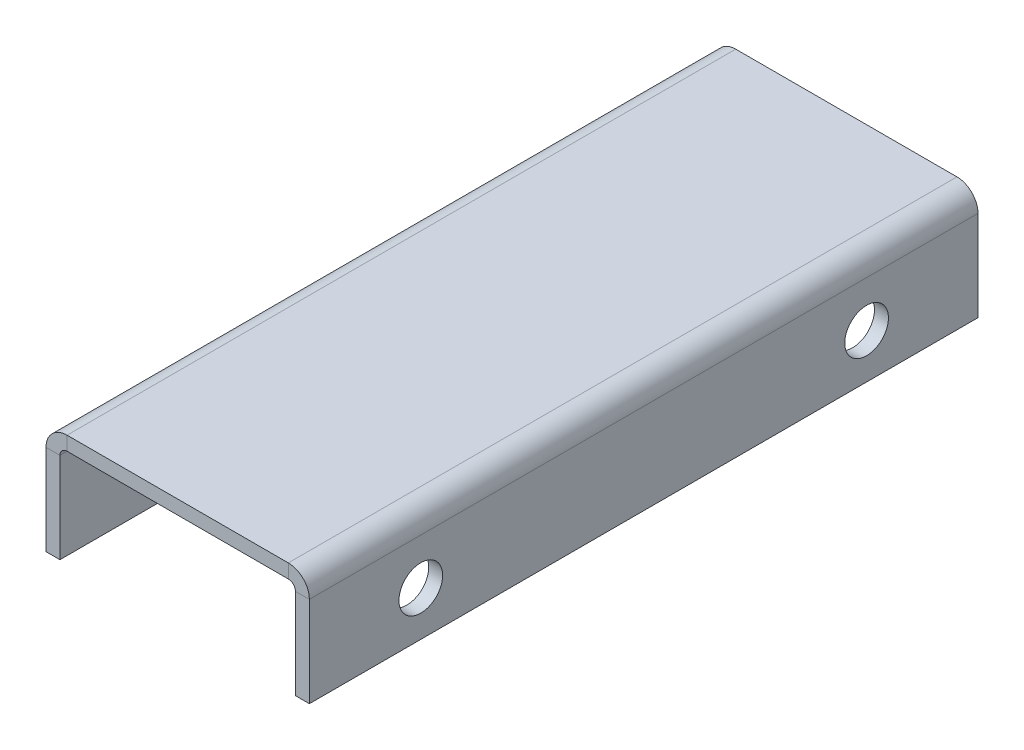
ISO-10303-21;
HEADER;
FILE_DESCRIPTION(('STEP AP214'),'2;1');
FILE_NAME('part.step','',(''),(''),'','','');
FILE_SCHEMA(('AUTOMOTIVE_DESIGN { 1 0 10303 214 1 1 1 1 }'));
ENDSEC;
DATA;
#1=APPLICATION_CONTEXT('core data for automotive mechanical design processes');
#2=APPLICATION_PROTOCOL_DEFINITION('international standard','automotive_design',2000,#1);
#3=PRODUCT_CONTEXT('',#1,'mechanical');
#4=PRODUCT('Part','Part','',(#3));
#5=PRODUCT_RELATED_PRODUCT_CATEGORY('part','',(#4));
#6=PRODUCT_DEFINITION_FORMATION('','',#4);
#7=PRODUCT_DEFINITION_CONTEXT('part definition',#1,'design');
#8=PRODUCT_DEFINITION('design','',#6,#7);
#9=PRODUCT_DEFINITION_SHAPE('','',#8);
#10=(LENGTH_UNIT() NAMED_UNIT(*) SI_UNIT(.MILLI.,.METRE.));
#11=(NAMED_UNIT(*) PLANE_ANGLE_UNIT() SI_UNIT($,.RADIAN.));
#12=(NAMED_UNIT(*) SI_UNIT($,.STERADIAN.) SOLID_ANGLE_UNIT());
#13=UNCERTAINTY_MEASURE_WITH_UNIT(LENGTH_MEASURE(1.E-05),#10,'distance_accuracy_value','');
#14=(GEOMETRIC_REPRESENTATION_CONTEXT(3) GLOBAL_UNCERTAINTY_ASSIGNED_CONTEXT((#13)) GLOBAL_UNIT_ASSIGNED_CONTEXT((#10,
#11,#12)) REPRESENTATION_CONTEXT('',''));
#15=CARTESIAN_POINT('',(0.,0.,0.));
#16=DIRECTION('',(0.,0.,1.));
#17=DIRECTION('',(1.,0.,0.));
#18=AXIS2_PLACEMENT_3D('',#15,#16,#17);
#19=CARTESIAN_POINT('',(-12.60602,0.,76.2));
#20=DIRECTION('',(0.,0.,1.));
#21=DIRECTION('',(1.,0.,0.));
#22=AXIS2_PLACEMENT_3D('',#19,#20,#21);
#23=PLANE('',#22);
#24=DIRECTION('',(0.,-1.,0.));
#25=VECTOR('',#24,1.);
#26=CARTESIAN_POINT('',(-12.60602,0.,76.2));
#27=LINE('',#26,#25);
#28=CARTESIAN_POINT('',(-12.60602,0.,76.2));
#29=VERTEX_POINT('',#28);
#30=CARTESIAN_POINT('',(-12.60602,-1.5875,76.2));
#31=VERTEX_POINT('',#30);
#32=EDGE_CURVE('E11',#29,#31,#27,.T.);
#33=ORIENTED_EDGE('',*,*,#32,.F.);
#34=CARTESIAN_POINT('',(-12.60602,-2.4003,76.2));
#35=DIRECTION('',(0.,0.,1.));
#36=DIRECTION('',(1.,0.,0.));
#37=AXIS2_PLACEMENT_3D('',#34,#35,#36);
#38=CIRCLE('',#37,2.4003);
#39=CARTESIAN_POINT('',(-15.00632,-2.4003,76.2));
#40=VERTEX_POINT('',#39);
#41=EDGE_CURVE('E280',#40,#29,#38,.F.);
#42=ORIENTED_EDGE('',*,*,#41,.F.);
#43=DIRECTION('',(-1.,0.,0.));
#44=VECTOR('',#43,1.);
#45=CARTESIAN_POINT('',(-13.41882,-2.4003,76.2));
#46=LINE('',#45,#44);
#47=CARTESIAN_POINT('',(-13.41882,-2.4003,76.2));
#48=VERTEX_POINT('',#47);
#49=EDGE_CURVE('E53',#48,#40,#46,.T.);
#50=ORIENTED_EDGE('',*,*,#49,.F.);
#51=CARTESIAN_POINT('',(-12.60602,-2.4003,76.2));
#52=DIRECTION('',(0.,0.,1.));
#53=DIRECTION('',(1.,0.,0.));
#54=AXIS2_PLACEMENT_3D('',#51,#52,#53);
#55=CIRCLE('',#54,0.8128);
#56=EDGE_CURVE('E155',#48,#31,#55,.F.);
#57=ORIENTED_EDGE('',*,*,#56,.T.);
#58=EDGE_LOOP('',(#33,#42,#50,#57));
#59=FACE_BOUND('',#58,.T.);
#60=ADVANCED_FACE('F44',(#59),#23,.T.);
#61=CARTESIAN_POINT('',(-13.41882,-2.4003,76.2));
#62=DIRECTION('',(0.,0.,1.));
#63=DIRECTION('',(1.,0.,0.));
#64=AXIS2_PLACEMENT_3D('',#61,#62,#63);
#65=PLANE('',#64);
#66=DIRECTION('',(1.,0.,0.));
#67=VECTOR('',#66,1.);
#68=CARTESIAN_POINT('',(-15.00632,0.,76.2));
#69=LINE('',#68,#67);
#70=CARTESIAN_POINT('',(12.60602,0.,76.2));
#71=VERTEX_POINT('',#70);
#72=EDGE_CURVE('E149',#29,#71,#69,.T.);
#73=ORIENTED_EDGE('',*,*,#72,.F.);
#74=ORIENTED_EDGE('',*,*,#32,.T.);
#75=DIRECTION('',(1.,0.,0.));
#76=VECTOR('',#75,1.);
#77=CARTESIAN_POINT('',(-15.00632,-1.5875,76.2));
#78=LINE('',#77,#76);
#79=CARTESIAN_POINT('',(12.60602,-1.5875,76.2));
#80=VERTEX_POINT('',#79);
#81=EDGE_CURVE('E146',#31,#80,#78,.T.);
#82=ORIENTED_EDGE('',*,*,#81,.T.);
#83=DIRECTION('',(0.,1.,0.));
#84=VECTOR('',#83,1.);
#85=CARTESIAN_POINT('',(12.60602,-1.5875,76.2));
#86=LINE('',#85,#84);
#87=EDGE_CURVE('E238',#80,#71,#86,.T.);
#88=ORIENTED_EDGE('',*,*,#87,.T.);
#89=EDGE_LOOP('',(#73,#74,#82,#88));
#90=FACE_BOUND('',#89,.T.);
#91=ADVANCED_FACE('F144',(#90),#65,.T.);
#92=CARTESIAN_POINT('',(-15.00632,-2.4003,0.));
#93=DIRECTION('',(0.,0.,-1.));
#94=DIRECTION('',(-1.,0.,0.));
#95=AXIS2_PLACEMENT_3D('',#92,#93,#94);
#96=PLANE('',#95);
#97=DIRECTION('',(1.,0.,0.));
#98=VECTOR('',#97,1.);
#99=CARTESIAN_POINT('',(-15.00632,-2.4003,0.));
#100=LINE('',#99,#98);
#101=CARTESIAN_POINT('',(-15.00632,-2.4003,0.));
#102=VERTEX_POINT('',#101);
#103=CARTESIAN_POINT('',(-13.41882,-2.4003,0.));
#104=VERTEX_POINT('',#103);
#105=EDGE_CURVE('E243',#102,#104,#100,.T.);
#106=ORIENTED_EDGE('',*,*,#105,.F.);
#107=CARTESIAN_POINT('',(-12.60602,-2.4003,0.));
#108=DIRECTION('',(0.,0.,1.));
#109=DIRECTION('',(1.,0.,0.));
#110=AXIS2_PLACEMENT_3D('',#107,#108,#109);
#111=CIRCLE('',#110,2.4003);
#112=CARTESIAN_POINT('',(-12.60602,0.,0.));
#113=VERTEX_POINT('',#112);
#114=EDGE_CURVE('E195',#102,#113,#111,.F.);
#115=ORIENTED_EDGE('',*,*,#114,.T.);
#116=DIRECTION('',(0.,1.,0.));
#117=VECTOR('',#116,1.);
#118=CARTESIAN_POINT('',(-12.60602,-1.5875,0.));
#119=LINE('',#118,#117);
#120=CARTESIAN_POINT('',(-12.60602,-1.5875,0.));
#121=VERTEX_POINT('',#120);
#122=EDGE_CURVE('E241',#121,#113,#119,.T.);
#123=ORIENTED_EDGE('',*,*,#122,.F.);
#124=CARTESIAN_POINT('',(-12.60602,-2.4003,0.));
#125=DIRECTION('',(0.,0.,1.));
#126=DIRECTION('',(1.,0.,0.));
#127=AXIS2_PLACEMENT_3D('',#124,#125,#126);
#128=CIRCLE('',#127,0.8128);
#129=EDGE_CURVE('E167',#104,#121,#128,.F.);
#130=ORIENTED_EDGE('',*,*,#129,.F.);
#131=EDGE_LOOP('',(#106,#115,#123,#130));
#132=FACE_BOUND('',#131,.T.);
#133=ADVANCED_FACE('F298',(#132),#96,.T.);
#134=CARTESIAN_POINT('',(-12.60602,-1.5875,0.));
#135=DIRECTION('',(0.,0.,-1.));
#136=DIRECTION('',(-1.,0.,0.));
#137=AXIS2_PLACEMENT_3D('',#134,#135,#136);
#138=PLANE('',#137);
#139=DIRECTION('',(0.,1.,0.));
#140=VECTOR('',#139,1.);
#141=CARTESIAN_POINT('',(-15.00632,-12.7,0.));
#142=LINE('',#141,#140);
#143=CARTESIAN_POINT('',(-15.00632,-12.7,0.));
#144=VERTEX_POINT('',#143);
#145=EDGE_CURVE('E198',#144,#102,#142,.T.);
#146=ORIENTED_EDGE('',*,*,#145,.T.);
#147=ORIENTED_EDGE('',*,*,#105,.T.);
#148=DIRECTION('',(0.,1.,0.));
#149=VECTOR('',#148,1.);
#150=CARTESIAN_POINT('',(-13.41882,-12.7,0.));
#151=LINE('',#150,#149);
#152=CARTESIAN_POINT('',(-13.41882,-12.7,0.));
#153=VERTEX_POINT('',#152);
#154=EDGE_CURVE('E204',#153,#104,#151,.T.);
#155=ORIENTED_EDGE('',*,*,#154,.F.);
#156=DIRECTION('',(-1.,0.,0.));
#157=VECTOR('',#156,1.);
#158=CARTESIAN_POINT('',(-13.41882,-12.7,0.));
#159=LINE('',#158,#157);
#160=EDGE_CURVE('E201',#153,#144,#159,.T.);
#161=ORIENTED_EDGE('',*,*,#160,.T.);
#162=EDGE_LOOP('',(#146,#147,#155,#161));
#163=FACE_BOUND('',#162,.T.);
#164=ADVANCED_FACE('F348',(#163),#138,.T.);
#165=CARTESIAN_POINT('',(15.00632,-2.4003,76.2));
#166=DIRECTION('',(0.,0.,1.));
#167=DIRECTION('',(1.,0.,0.));
#168=AXIS2_PLACEMENT_3D('',#165,#166,#167);
#169=PLANE('',#168);
#170=DIRECTION('',(-1.,0.,0.));
#171=VECTOR('',#170,1.);
#172=CARTESIAN_POINT('',(15.00632,-2.4003,76.2));
#173=LINE('',#172,#171);
#174=CARTESIAN_POINT('',(15.00632,-2.4003,76.2));
#175=VERTEX_POINT('',#174);
#176=CARTESIAN_POINT('',(13.41882,-2.4003,76.2));
#177=VERTEX_POINT('',#176);
#178=EDGE_CURVE('E62',#175,#177,#173,.T.);
#179=ORIENTED_EDGE('',*,*,#178,.F.);
#180=CARTESIAN_POINT('',(12.60602,-2.4003,76.2));
#181=DIRECTION('',(0.,0.,1.));
#182=DIRECTION('',(1.,0.,0.));
#183=AXIS2_PLACEMENT_3D('',#180,#181,#182);
#184=CIRCLE('',#183,2.4003);
#185=EDGE_CURVE('E276',#71,#175,#184,.F.);
#186=ORIENTED_EDGE('',*,*,#185,.F.);
#187=ORIENTED_EDGE('',*,*,#87,.F.);
#188=CARTESIAN_POINT('',(12.60602,-2.4003,76.2));
#189=DIRECTION('',(0.,0.,1.));
#190=DIRECTION('',(1.,0.,0.));
#191=AXIS2_PLACEMENT_3D('',#188,#189,#190);
#192=CIRCLE('',#191,0.8128);
#193=EDGE_CURVE('E175',#80,#177,#192,.F.);
#194=ORIENTED_EDGE('',*,*,#193,.T.);
#195=EDGE_LOOP('',(#179,#186,#187,#194));
#196=FACE_BOUND('',#195,.T.);
#197=ADVANCED_FACE('F353',(#196),#169,.T.);
#198=CARTESIAN_POINT('',(12.60602,-1.5875,76.2));
#199=DIRECTION('',(0.,0.,1.));
#200=DIRECTION('',(1.,0.,0.));
#201=AXIS2_PLACEMENT_3D('',#198,#199,#200);
#202=PLANE('',#201);
#203=DIRECTION('',(0.,-1.,0.));
#204=VECTOR('',#203,1.);
#205=CARTESIAN_POINT('',(15.00632,0.,76.2));
#206=LINE('',#205,#204);
#207=CARTESIAN_POINT('',(15.00632,-12.7,76.2));
#208=VERTEX_POINT('',#207);
#209=EDGE_CURVE('E273',#175,#208,#206,.T.);
#210=ORIENTED_EDGE('',*,*,#209,.F.);
#211=ORIENTED_EDGE('',*,*,#178,.T.);
#212=DIRECTION('',(0.,1.,0.));
#213=VECTOR('',#212,1.);
#214=CARTESIAN_POINT('',(13.41882,0.,76.2));
#215=LINE('',#214,#213);
#216=CARTESIAN_POINT('',(13.41882,-12.7,76.2));
#217=VERTEX_POINT('',#216);
#218=EDGE_CURVE('E116',#177,#217,#215,.F.);
#219=ORIENTED_EDGE('',*,*,#218,.T.);
#220=DIRECTION('',(-1.,0.,0.));
#221=VECTOR('',#220,1.);
#222=CARTESIAN_POINT('',(15.00632,-12.7,76.2));
#223=LINE('',#222,#221);
#224=EDGE_CURVE('E270',#208,#217,#223,.T.);
#225=ORIENTED_EDGE('',*,*,#224,.F.);
#226=EDGE_LOOP('',(#210,#211,#219,#225));
#227=FACE_BOUND('',#226,.T.);
#228=ADVANCED_FACE('F325',(#227),#202,.T.);
#229=CARTESIAN_POINT('',(12.60602,0.,0.));
#230=DIRECTION('',(0.,0.,-1.));
#231=DIRECTION('',(-1.,0.,0.));
#232=AXIS2_PLACEMENT_3D('',#229,#230,#231);
#233=PLANE('',#232);
#234=DIRECTION('',(0.,-1.,0.));
#235=VECTOR('',#234,1.);
#236=CARTESIAN_POINT('',(12.60602,0.,0.));
#237=LINE('',#236,#235);
#238=CARTESIAN_POINT('',(12.60602,0.,0.));
#239=VERTEX_POINT('',#238);
#240=CARTESIAN_POINT('',(12.60602,-1.5875,0.));
#241=VERTEX_POINT('',#240);
#242=EDGE_CURVE('E103',#239,#241,#237,.T.);
#243=ORIENTED_EDGE('',*,*,#242,.F.);
#244=CARTESIAN_POINT('',(12.60602,-2.4003,0.));
#245=DIRECTION('',(0.,0.,1.));
#246=DIRECTION('',(1.,0.,0.));
#247=AXIS2_PLACEMENT_3D('',#244,#245,#246);
#248=CIRCLE('',#247,2.4003);
#249=CARTESIAN_POINT('',(15.00632,-2.4003,0.));
#250=VERTEX_POINT('',#249);
#251=EDGE_CURVE('E191',#239,#250,#248,.F.);
#252=ORIENTED_EDGE('',*,*,#251,.T.);
#253=DIRECTION('',(1.,0.,0.));
#254=VECTOR('',#253,1.);
#255=CARTESIAN_POINT('',(13.41882,-2.4003,0.));
#256=LINE('',#255,#254);
#257=CARTESIAN_POINT('',(13.41882,-2.4003,0.));
#258=VERTEX_POINT('',#257);
#259=EDGE_CURVE('E110',#258,#250,#256,.T.);
#260=ORIENTED_EDGE('',*,*,#259,.F.);
#261=CARTESIAN_POINT('',(12.60602,-2.4003,0.));
#262=DIRECTION('',(0.,0.,1.));
#263=DIRECTION('',(1.,0.,0.));
#264=AXIS2_PLACEMENT_3D('',#261,#262,#263);
#265=CIRCLE('',#264,0.8128);
#266=EDGE_CURVE('E210',#241,#258,#265,.F.);
#267=ORIENTED_EDGE('',*,*,#266,.F.);
#268=EDGE_LOOP('',(#243,#252,#260,#267));
#269=FACE_BOUND('',#268,.T.);
#270=ADVANCED_FACE('F313',(#269),#233,.T.);
#271=CARTESIAN_POINT('',(13.41882,-2.4003,0.));
#272=DIRECTION('',(0.,0.,-1.));
#273=DIRECTION('',(-1.,0.,0.));
#274=AXIS2_PLACEMENT_3D('',#271,#272,#273);
#275=PLANE('',#274);
#276=DIRECTION('',(1.,0.,0.));
#277=VECTOR('',#276,1.);
#278=CARTESIAN_POINT('',(-15.00632,0.,0.));
#279=LINE('',#278,#277);
#280=EDGE_CURVE('E193',#113,#239,#279,.T.);
#281=ORIENTED_EDGE('',*,*,#280,.T.);
#282=ORIENTED_EDGE('',*,*,#242,.T.);
#283=DIRECTION('',(1.,0.,0.));
#284=VECTOR('',#283,1.);
#285=CARTESIAN_POINT('',(-15.00632,-1.5875,0.));
#286=LINE('',#285,#284);
#287=EDGE_CURVE('E208',#121,#241,#286,.T.);
#288=ORIENTED_EDGE('',*,*,#287,.F.);
#289=ORIENTED_EDGE('',*,*,#122,.T.);
#290=EDGE_LOOP('',(#281,#282,#288,#289));
#291=FACE_BOUND('',#290,.T.);
#292=ADVANCED_FACE('F300',(#291),#275,.T.);
#293=CARTESIAN_POINT('',(13.41882,0.,76.2));
#294=DIRECTION('',(1.,0.,0.));
#295=DIRECTION('',(0.,0.,-1.));
#296=AXIS2_PLACEMENT_3D('',#293,#294,#295);
#297=PLANE('',#296);
#298=CARTESIAN_POINT('',(13.41882,-7.62,63.5));
#299=DIRECTION('',(1.,0.,0.));
#300=DIRECTION('',(0.,0.,-1.));
#301=AXIS2_PLACEMENT_3D('',#298,#299,#300);
#302=CIRCLE('',#301,2.4892);
#303=CARTESIAN_POINT('',(13.41882,-7.62,61.0108));
#304=VERTEX_POINT('',#303);
#305=EDGE_CURVE('E185',#304,#304,#302,.T.);
#306=ORIENTED_EDGE('',*,*,#305,.T.);
#307=EDGE_LOOP('',(#306));
#308=FACE_BOUND('',#307,.T.);
#309=CARTESIAN_POINT('',(13.41882,-7.62,12.7));
#310=DIRECTION('',(1.,0.,0.));
#311=DIRECTION('',(0.,0.,-1.));
#312=AXIS2_PLACEMENT_3D('',#309,#310,#311);
#313=CIRCLE('',#312,2.4892);
#314=CARTESIAN_POINT('',(13.41882,-7.62,10.2108));
#315=VERTEX_POINT('',#314);
#316=EDGE_CURVE('E247',#315,#315,#313,.T.);
#317=ORIENTED_EDGE('',*,*,#316,.T.);
#318=EDGE_LOOP('',(#317));
#319=FACE_BOUND('',#318,.T.);
#320=DIRECTION('',(0.,1.,0.));
#321=VECTOR('',#320,1.);
#322=CARTESIAN_POINT('',(13.41882,0.,0.));
#323=LINE('',#322,#321);
#324=CARTESIAN_POINT('',(13.41882,-12.7,0.));
#325=VERTEX_POINT('',#324);
#326=EDGE_CURVE('E181',#258,#325,#323,.F.);
#327=ORIENTED_EDGE('',*,*,#326,.T.);
#328=DIRECTION('',(0.,0.,-1.));
#329=VECTOR('',#328,1.);
#330=CARTESIAN_POINT('',(13.41882,-12.7,76.2));
#331=LINE('',#330,#329);
#332=EDGE_CURVE('E234',#217,#325,#331,.T.);
#333=ORIENTED_EDGE('',*,*,#332,.F.);
#334=ORIENTED_EDGE('',*,*,#218,.F.);
#335=DIRECTION('',(0.,0.,-1.));
#336=VECTOR('',#335,1.);
#337=CARTESIAN_POINT('',(13.41882,-2.4003,76.2));
#338=LINE('',#337,#336);
#339=EDGE_CURVE('E177',#177,#258,#338,.T.);
#340=ORIENTED_EDGE('',*,*,#339,.T.);
#341=EDGE_LOOP('',(#327,#333,#334,#340));
#342=FACE_BOUND('',#341,.T.);
#343=ADVANCED_FACE('F319',(#308,#319,#342),#297,.F.);
#344=CARTESIAN_POINT('',(15.00632,-12.7,76.2));
#345=DIRECTION('',(0.,-1.,0.));
#346=DIRECTION('',(0.,0.,-1.));
#347=AXIS2_PLACEMENT_3D('',#344,#345,#346);
#348=PLANE('',#347);
#349=DIRECTION('',(-1.,0.,0.));
#350=VECTOR('',#349,1.);
#351=CARTESIAN_POINT('',(15.00632,-12.7,0.));
#352=LINE('',#351,#350);
#353=CARTESIAN_POINT('',(15.00632,-12.7,0.));
#354=VERTEX_POINT('',#353);
#355=EDGE_CURVE('E184',#354,#325,#352,.T.);
#356=ORIENTED_EDGE('',*,*,#355,.F.);
#357=DIRECTION('',(0.,0.,-1.));
#358=VECTOR('',#357,1.);
#359=CARTESIAN_POINT('',(15.00632,-12.7,76.2));
#360=LINE('',#359,#358);
#361=EDGE_CURVE('E232',#208,#354,#360,.T.);
#362=ORIENTED_EDGE('',*,*,#361,.F.);
#363=ORIENTED_EDGE('',*,*,#224,.T.);
#364=ORIENTED_EDGE('',*,*,#332,.T.);
#365=EDGE_LOOP('',(#356,#362,#363,#364));
#366=FACE_BOUND('',#365,.T.);
#367=ADVANCED_FACE('F324',(#366),#348,.T.);
#368=CARTESIAN_POINT('',(15.00632,0.,76.2));
#369=DIRECTION('',(1.,0.,0.));
#370=DIRECTION('',(0.,0.,-1.));
#371=AXIS2_PLACEMENT_3D('',#368,#369,#370);
#372=PLANE('',#371);
#373=CARTESIAN_POINT('',(15.00632,-7.62,63.5));
#374=DIRECTION('',(1.,0.,0.));
#375=DIRECTION('',(0.,0.,-1.));
#376=AXIS2_PLACEMENT_3D('',#373,#374,#375);
#377=CIRCLE('',#376,2.4892);
#378=CARTESIAN_POINT('',(15.00632,-7.62,61.0108));
#379=VERTEX_POINT('',#378);
#380=EDGE_CURVE('E254',#379,#379,#377,.T.);
#381=ORIENTED_EDGE('',*,*,#380,.F.);
#382=EDGE_LOOP('',(#381));
#383=FACE_BOUND('',#382,.T.);
#384=CARTESIAN_POINT('',(15.00632,-7.62,12.7));
#385=DIRECTION('',(1.,0.,0.));
#386=DIRECTION('',(0.,0.,-1.));
#387=AXIS2_PLACEMENT_3D('',#384,#385,#386);
#388=CIRCLE('',#387,2.4892);
#389=CARTESIAN_POINT('',(15.00632,-7.62,10.2108));
#390=VERTEX_POINT('',#389);
#391=EDGE_CURVE('E259',#390,#390,#388,.T.);
#392=ORIENTED_EDGE('',*,*,#391,.F.);
#393=EDGE_LOOP('',(#392));
#394=FACE_BOUND('',#393,.T.);
#395=DIRECTION('',(0.,-1.,0.));
#396=VECTOR('',#395,1.);
#397=CARTESIAN_POINT('',(15.00632,0.,0.));
#398=LINE('',#397,#396);
#399=EDGE_CURVE('E188',#250,#354,#398,.T.);
#400=ORIENTED_EDGE('',*,*,#399,.F.);
#401=DIRECTION('',(0.,0.,-1.));
#402=VECTOR('',#401,1.);
#403=CARTESIAN_POINT('',(15.00632,-2.4003,76.2));
#404=LINE('',#403,#402);
#405=EDGE_CURVE('E229',#175,#250,#404,.T.);
#406=ORIENTED_EDGE('',*,*,#405,.F.);
#407=ORIENTED_EDGE('',*,*,#209,.T.);
#408=ORIENTED_EDGE('',*,*,#361,.T.);
#409=EDGE_LOOP('',(#400,#406,#407,#408));
#410=FACE_BOUND('',#409,.T.);
#411=ADVANCED_FACE('F327',(#383,#394,#410),#372,.T.);
#412=CARTESIAN_POINT('',(12.60602,-2.4003,76.2));
#413=DIRECTION('',(0.,0.,-1.));
#414=DIRECTION('',(-1.,0.,0.));
#415=AXIS2_PLACEMENT_3D('',#412,#413,#414);
#416=CYLINDRICAL_SURFACE('',#415,2.4003);
#417=ORIENTED_EDGE('',*,*,#251,.F.);
#418=DIRECTION('',(0.,0.,-1.));
#419=VECTOR('',#418,1.);
#420=CARTESIAN_POINT('',(12.60602,0.,76.2));
#421=LINE('',#420,#419);
#422=EDGE_CURVE('E226',#71,#239,#421,.T.);
#423=ORIENTED_EDGE('',*,*,#422,.F.);
#424=ORIENTED_EDGE('',*,*,#185,.T.);
#425=ORIENTED_EDGE('',*,*,#405,.T.);
#426=EDGE_LOOP('',(#417,#423,#424,#425));
#427=FACE_BOUND('',#426,.T.);
#428=ADVANCED_FACE('F310',(#427),#416,.T.);
#429=CARTESIAN_POINT('',(-15.00632,0.,76.2));
#430=DIRECTION('',(0.,1.,0.));
#431=DIRECTION('',(0.,0.,1.));
#432=AXIS2_PLACEMENT_3D('',#429,#430,#431);
#433=PLANE('',#432);
#434=ORIENTED_EDGE('',*,*,#280,.F.);
#435=DIRECTION('',(0.,0.,-1.));
#436=VECTOR('',#435,1.);
#437=CARTESIAN_POINT('',(-12.60602,0.,76.2));
#438=LINE('',#437,#436);
#439=EDGE_CURVE('E223',#29,#113,#438,.T.);
#440=ORIENTED_EDGE('',*,*,#439,.F.);
#441=ORIENTED_EDGE('',*,*,#72,.T.);
#442=ORIENTED_EDGE('',*,*,#422,.T.);
#443=EDGE_LOOP('',(#434,#440,#441,#442));
#444=FACE_BOUND('',#443,.T.);
#445=ADVANCED_FACE('F305',(#444),#433,.T.);
#446=CARTESIAN_POINT('',(-12.60602,-2.4003,76.2));
#447=DIRECTION('',(0.,0.,-1.));
#448=DIRECTION('',(-1.,0.,0.));
#449=AXIS2_PLACEMENT_3D('',#446,#447,#448);
#450=CYLINDRICAL_SURFACE('',#449,2.4003);
#451=ORIENTED_EDGE('',*,*,#114,.F.);
#452=DIRECTION('',(0.,0.,-1.));
#453=VECTOR('',#452,1.);
#454=CARTESIAN_POINT('',(-15.00632,-2.4003,76.2));
#455=LINE('',#454,#453);
#456=EDGE_CURVE('E220',#40,#102,#455,.T.);
#457=ORIENTED_EDGE('',*,*,#456,.F.);
#458=ORIENTED_EDGE('',*,*,#41,.T.);
#459=ORIENTED_EDGE('',*,*,#439,.T.);
#460=EDGE_LOOP('',(#451,#457,#458,#459));
#461=FACE_BOUND('',#460,.T.);
#462=ADVANCED_FACE('F303',(#461),#450,.T.);
#463=CARTESIAN_POINT('',(-15.00632,-12.7,76.2));
#464=DIRECTION('',(-1.,0.,0.));
#465=DIRECTION('',(0.,0.,1.));
#466=AXIS2_PLACEMENT_3D('',#463,#464,#465);
#467=PLANE('',#466);
#468=CARTESIAN_POINT('',(-15.00632,-7.62,63.5));
#469=DIRECTION('',(1.,0.,0.));
#470=DIRECTION('',(0.,0.,-1.));
#471=AXIS2_PLACEMENT_3D('',#468,#469,#470);
#472=CIRCLE('',#471,2.4892);
#473=CARTESIAN_POINT('',(-15.00632,-7.62,61.0108));
#474=VERTEX_POINT('',#473);
#475=EDGE_CURVE('E248',#474,#474,#472,.T.);
#476=ORIENTED_EDGE('',*,*,#475,.T.);
#477=EDGE_LOOP('',(#476));
#478=FACE_BOUND('',#477,.T.);
#479=CARTESIAN_POINT('',(-15.00632,-7.62,12.7));
#480=DIRECTION('',(1.,0.,0.));
#481=DIRECTION('',(0.,0.,-1.));
#482=AXIS2_PLACEMENT_3D('',#479,#480,#481);
#483=CIRCLE('',#482,2.4892);
#484=CARTESIAN_POINT('',(-15.00632,-7.62,10.2108));
#485=VERTEX_POINT('',#484);
#486=EDGE_CURVE('E264',#485,#485,#483,.T.);
#487=ORIENTED_EDGE('',*,*,#486,.T.);
#488=EDGE_LOOP('',(#487));
#489=FACE_BOUND('',#488,.T.);
#490=ORIENTED_EDGE('',*,*,#145,.F.);
#491=DIRECTION('',(0.,0.,-1.));
#492=VECTOR('',#491,1.);
#493=CARTESIAN_POINT('',(-15.00632,-12.7,76.2));
#494=LINE('',#493,#492);
#495=CARTESIAN_POINT('',(-15.00632,-12.7,76.2));
#496=VERTEX_POINT('',#495);
#497=EDGE_CURVE('E218',#496,#144,#494,.T.);
#498=ORIENTED_EDGE('',*,*,#497,.F.);
#499=DIRECTION('',(0.,1.,0.));
#500=VECTOR('',#499,1.);
#501=CARTESIAN_POINT('',(-15.00632,-12.7,76.2));
#502=LINE('',#501,#500);
#503=EDGE_CURVE('E282',#496,#40,#502,.T.);
#504=ORIENTED_EDGE('',*,*,#503,.T.);
#505=ORIENTED_EDGE('',*,*,#456,.T.);
#506=EDGE_LOOP('',(#490,#498,#504,#505));
#507=FACE_BOUND('',#506,.T.);
#508=ADVANCED_FACE('F396',(#478,#489,#507),#467,.T.);
#509=CARTESIAN_POINT('',(-13.41882,-12.7,76.2));
#510=DIRECTION('',(0.,-1.,0.));
#511=DIRECTION('',(0.,0.,-1.));
#512=AXIS2_PLACEMENT_3D('',#509,#510,#511);
#513=PLANE('',#512);
#514=ORIENTED_EDGE('',*,*,#160,.F.);
#515=DIRECTION('',(0.,0.,-1.));
#516=VECTOR('',#515,1.);
#517=CARTESIAN_POINT('',(-13.41882,-12.7,76.2));
#518=LINE('',#517,#516);
#519=CARTESIAN_POINT('',(-13.41882,-12.7,76.2));
#520=VERTEX_POINT('',#519);
#521=EDGE_CURVE('E216',#520,#153,#518,.T.);
#522=ORIENTED_EDGE('',*,*,#521,.F.);
#523=DIRECTION('',(-1.,0.,0.));
#524=VECTOR('',#523,1.);
#525=CARTESIAN_POINT('',(-13.41882,-12.7,76.2));
#526=LINE('',#525,#524);
#527=EDGE_CURVE('E285',#520,#496,#526,.T.);
#528=ORIENTED_EDGE('',*,*,#527,.T.);
#529=ORIENTED_EDGE('',*,*,#497,.T.);
#530=EDGE_LOOP('',(#514,#522,#528,#529));
#531=FACE_BOUND('',#530,.T.);
#532=ADVANCED_FACE('F398',(#531),#513,.T.);
#533=CARTESIAN_POINT('',(-13.41882,-12.7,76.2));
#534=DIRECTION('',(-1.,0.,0.));
#535=DIRECTION('',(0.,0.,1.));
#536=AXIS2_PLACEMENT_3D('',#533,#534,#535);
#537=PLANE('',#536);
#538=CARTESIAN_POINT('',(-13.41882,-7.62,63.5));
#539=DIRECTION('',(-1.,0.,0.));
#540=DIRECTION('',(0.,0.,1.));
#541=AXIS2_PLACEMENT_3D('',#538,#539,#540);
#542=CIRCLE('',#541,2.4892);
#543=CARTESIAN_POINT('',(-13.41882,-7.62,61.0108));
#544=VERTEX_POINT('',#543);
#545=EDGE_CURVE('E47',#544,#544,#542,.T.);
#546=ORIENTED_EDGE('',*,*,#545,.T.);
#547=EDGE_LOOP('',(#546));
#548=FACE_BOUND('',#547,.T.);
#549=CARTESIAN_POINT('',(-13.41882,-7.62,12.7));
#550=DIRECTION('',(-1.,0.,0.));
#551=DIRECTION('',(0.,0.,1.));
#552=AXIS2_PLACEMENT_3D('',#549,#550,#551);
#553=CIRCLE('',#552,2.4892);
#554=CARTESIAN_POINT('',(-13.41882,-7.62,10.2108));
#555=VERTEX_POINT('',#554);
#556=EDGE_CURVE('E245',#555,#555,#553,.T.);
#557=ORIENTED_EDGE('',*,*,#556,.T.);
#558=EDGE_LOOP('',(#557));
#559=FACE_BOUND('',#558,.T.);
#560=ORIENTED_EDGE('',*,*,#154,.T.);
#561=DIRECTION('',(0.,0.,-1.));
#562=VECTOR('',#561,1.);
#563=CARTESIAN_POINT('',(-13.41882,-2.4003,76.2));
#564=LINE('',#563,#562);
#565=EDGE_CURVE('E169',#48,#104,#564,.T.);
#566=ORIENTED_EDGE('',*,*,#565,.F.);
#567=DIRECTION('',(0.,1.,0.));
#568=VECTOR('',#567,1.);
#569=CARTESIAN_POINT('',(-13.41882,-12.7,76.2));
#570=LINE('',#569,#568);
#571=EDGE_CURVE('E160',#520,#48,#570,.T.);
#572=ORIENTED_EDGE('',*,*,#571,.F.);
#573=ORIENTED_EDGE('',*,*,#521,.T.);
#574=EDGE_LOOP('',(#560,#566,#572,#573));
#575=FACE_BOUND('',#574,.T.);
#576=ADVANCED_FACE('F295',(#548,#559,#575),#537,.F.);
#577=CARTESIAN_POINT('',(-12.60602,-2.4003,76.2));
#578=DIRECTION('',(0.,0.,-1.));
#579=DIRECTION('',(-1.,0.,0.));
#580=AXIS2_PLACEMENT_3D('',#577,#578,#579);
#581=CYLINDRICAL_SURFACE('',#580,0.8128);
#582=ORIENTED_EDGE('',*,*,#129,.T.);
#583=DIRECTION('',(0.,0.,-1.));
#584=VECTOR('',#583,1.);
#585=CARTESIAN_POINT('',(-12.60602,-1.5875,76.2));
#586=LINE('',#585,#584);
#587=EDGE_CURVE('E164',#31,#121,#586,.T.);
#588=ORIENTED_EDGE('',*,*,#587,.F.);
#589=ORIENTED_EDGE('',*,*,#56,.F.);
#590=ORIENTED_EDGE('',*,*,#565,.T.);
#591=EDGE_LOOP('',(#582,#588,#589,#590));
#592=FACE_BOUND('',#591,.T.);
#593=ADVANCED_FACE('F165',(#592),#581,.F.);
#594=CARTESIAN_POINT('',(-15.00632,-1.5875,76.2));
#595=DIRECTION('',(0.,1.,0.));
#596=DIRECTION('',(0.,0.,1.));
#597=AXIS2_PLACEMENT_3D('',#594,#595,#596);
#598=PLANE('',#597);
#599=ORIENTED_EDGE('',*,*,#287,.T.);
#600=DIRECTION('',(0.,0.,-1.));
#601=VECTOR('',#600,1.);
#602=CARTESIAN_POINT('',(12.60602,-1.5875,76.2));
#603=LINE('',#602,#601);
#604=EDGE_CURVE('E170',#80,#241,#603,.T.);
#605=ORIENTED_EDGE('',*,*,#604,.F.);
#606=ORIENTED_EDGE('',*,*,#81,.F.);
#607=ORIENTED_EDGE('',*,*,#587,.T.);
#608=EDGE_LOOP('',(#599,#605,#606,#607));
#609=FACE_BOUND('',#608,.T.);
#610=ADVANCED_FACE('F172',(#609),#598,.F.);
#611=CARTESIAN_POINT('',(12.60602,-2.4003,76.2));
#612=DIRECTION('',(0.,0.,-1.));
#613=DIRECTION('',(-1.,0.,0.));
#614=AXIS2_PLACEMENT_3D('',#611,#612,#613);
#615=CYLINDRICAL_SURFACE('',#614,0.8128);
#616=ORIENTED_EDGE('',*,*,#266,.T.);
#617=ORIENTED_EDGE('',*,*,#339,.F.);
#618=ORIENTED_EDGE('',*,*,#193,.F.);
#619=ORIENTED_EDGE('',*,*,#604,.T.);
#620=EDGE_LOOP('',(#616,#617,#618,#619));
#621=FACE_BOUND('',#620,.T.);
#622=ADVANCED_FACE('F316',(#621),#615,.F.);
#623=CARTESIAN_POINT('',(12.60602,-2.4003,76.2));
#624=DIRECTION('',(0.,0.,1.));
#625=DIRECTION('',(1.,0.,0.));
#626=AXIS2_PLACEMENT_3D('',#623,#624,#625);
#627=PLANE('',#626);
#628=ORIENTED_EDGE('',*,*,#571,.T.);
#629=ORIENTED_EDGE('',*,*,#49,.T.);
#630=ORIENTED_EDGE('',*,*,#503,.F.);
#631=ORIENTED_EDGE('',*,*,#527,.F.);
#632=EDGE_LOOP('',(#628,#629,#630,#631));
#633=FACE_BOUND('',#632,.T.);
#634=ADVANCED_FACE('F291',(#633),#627,.T.);
#635=CARTESIAN_POINT('',(12.60602,-2.4003,0.));
#636=DIRECTION('',(0.,0.,1.));
#637=DIRECTION('',(1.,0.,0.));
#638=AXIS2_PLACEMENT_3D('',#635,#636,#637);
#639=PLANE('',#638);
#640=ORIENTED_EDGE('',*,*,#326,.F.);
#641=ORIENTED_EDGE('',*,*,#259,.T.);
#642=ORIENTED_EDGE('',*,*,#399,.T.);
#643=ORIENTED_EDGE('',*,*,#355,.T.);
#644=EDGE_LOOP('',(#640,#641,#642,#643));
#645=FACE_BOUND('',#644,.T.);
#646=ADVANCED_FACE('F321',(#645),#639,.F.);
#647=CARTESIAN_POINT('',(-15.00632,-7.62,12.7));
#648=DIRECTION('',(1.,0.,0.));
#649=DIRECTION('',(0.,0.,-1.));
#650=AXIS2_PLACEMENT_3D('',#647,#648,#649);
#651=CYLINDRICAL_SURFACE('',#650,2.4892);
#652=CARTESIAN_POINT('',(-15.00632,-7.62,10.2108));
#653=CARTESIAN_POINT('',(-14.9897835416667,-7.62,10.2108));
#654=CARTESIAN_POINT('',(-14.9732470833333,-7.62,10.2108));
#655=CARTESIAN_POINT('',(-14.9401741666667,-7.62,10.2108));
#656=CARTESIAN_POINT('',(-14.9236377083333,-7.62,10.2108));
#657=CARTESIAN_POINT('',(-14.8905647916667,-7.62,10.2108));
#658=CARTESIAN_POINT('',(-14.8740283333333,-7.62,10.2108));
#659=CARTESIAN_POINT('',(-14.8409554166667,-7.62,10.2108));
#660=CARTESIAN_POINT('',(-14.8244189583333,-7.62,10.2108));
#661=CARTESIAN_POINT('',(-14.7913460416667,-7.62,10.2108));
#662=CARTESIAN_POINT('',(-14.7748095833333,-7.62,10.2108));
#663=CARTESIAN_POINT('',(-14.7417366666667,-7.62,10.2108));
#664=CARTESIAN_POINT('',(-14.7252002083333,-7.62,10.2108));
#665=CARTESIAN_POINT('',(-14.6921272916667,-7.62,10.2108));
#666=CARTESIAN_POINT('',(-14.6755908333333,-7.62,10.2108));
#667=CARTESIAN_POINT('',(-14.6425179166667,-7.62,10.2108));
#668=CARTESIAN_POINT('',(-14.6259814583333,-7.62,10.2108));
#669=CARTESIAN_POINT('',(-14.5929085416667,-7.62,10.2108));
#670=CARTESIAN_POINT('',(-14.5763720833333,-7.62,10.2108));
#671=CARTESIAN_POINT('',(-14.5432991666667,-7.62,10.2108));
#672=CARTESIAN_POINT('',(-14.5267627083333,-7.62,10.2108));
#673=CARTESIAN_POINT('',(-14.4936897916667,-7.62,10.2108));
#674=CARTESIAN_POINT('',(-14.4771533333333,-7.62,10.2108));
#675=CARTESIAN_POINT('',(-14.4440804166667,-7.62,10.2108));
#676=CARTESIAN_POINT('',(-14.4275439583333,-7.62,10.2108));
#677=CARTESIAN_POINT('',(-14.3944710416667,-7.62,10.2108));
#678=CARTESIAN_POINT('',(-14.3779345833333,-7.62,10.2108));
#679=CARTESIAN_POINT('',(-14.3448616666667,-7.62,10.2108));
#680=CARTESIAN_POINT('',(-14.3283252083333,-7.62,10.2108));
#681=CARTESIAN_POINT('',(-14.2952522916667,-7.62,10.2108));
#682=CARTESIAN_POINT('',(-14.2787158333333,-7.62,10.2108));
#683=CARTESIAN_POINT('',(-14.2456429166667,-7.62,10.2108));
#684=CARTESIAN_POINT('',(-14.2291064583333,-7.62,10.2108));
#685=CARTESIAN_POINT('',(-14.1960335416667,-7.62,10.2108));
#686=CARTESIAN_POINT('',(-14.1794970833333,-7.62,10.2108));
#687=CARTESIAN_POINT('',(-14.1464241666667,-7.62,10.2108));
#688=CARTESIAN_POINT('',(-14.1298877083333,-7.62,10.2108));
#689=CARTESIAN_POINT('',(-14.0968147916667,-7.62,10.2108));
#690=CARTESIAN_POINT('',(-14.0802783333333,-7.62,10.2108));
#691=CARTESIAN_POINT('',(-14.0472054166667,-7.62,10.2108));
#692=CARTESIAN_POINT('',(-14.0306689583333,-7.62,10.2108));
#693=CARTESIAN_POINT('',(-13.9975960416667,-7.62,10.2108));
#694=CARTESIAN_POINT('',(-13.9810595833333,-7.62,10.2108));
#695=CARTESIAN_POINT('',(-13.9479866666667,-7.62,10.2108));
#696=CARTESIAN_POINT('',(-13.9314502083333,-7.62,10.2108));
#697=CARTESIAN_POINT('',(-13.8983772916667,-7.62,10.2108));
#698=CARTESIAN_POINT('',(-13.8818408333333,-7.62,10.2108));
#699=CARTESIAN_POINT('',(-13.8487679166667,-7.62,10.2108));
#700=CARTESIAN_POINT('',(-13.8322314583333,-7.62,10.2108));
#701=CARTESIAN_POINT('',(-13.7991585416667,-7.62,10.2108));
#702=CARTESIAN_POINT('',(-13.7826220833333,-7.62,10.2108));
#703=CARTESIAN_POINT('',(-13.7495491666667,-7.62,10.2108));
#704=CARTESIAN_POINT('',(-13.7330127083333,-7.62,10.2108));
#705=CARTESIAN_POINT('',(-13.6999397916667,-7.62,10.2108));
#706=CARTESIAN_POINT('',(-13.6834033333333,-7.62,10.2108));
#707=CARTESIAN_POINT('',(-13.6503304166667,-7.62,10.2108));
#708=CARTESIAN_POINT('',(-13.6337939583333,-7.62,10.2108));
#709=CARTESIAN_POINT('',(-13.6007210416667,-7.62,10.2108));
#710=CARTESIAN_POINT('',(-13.5841845833333,-7.62,10.2108));
#711=CARTESIAN_POINT('',(-13.5511116666667,-7.62,10.2108));
#712=CARTESIAN_POINT('',(-13.5345752083333,-7.62,10.2108));
#713=CARTESIAN_POINT('',(-13.5015022916667,-7.62,10.2108));
#714=CARTESIAN_POINT('',(-13.4849658333333,-7.62,10.2108));
#715=CARTESIAN_POINT('',(-13.4518929166667,-7.62,10.2108));
#716=CARTESIAN_POINT('',(-13.4353564583333,-7.62,10.2108));
#717=CARTESIAN_POINT('',(-13.41882,-7.62,10.2108));
#718=B_SPLINE_CURVE_WITH_KNOTS('',3,(#652,#653,#654,#655,#656,#657,#658,#659,#660,#661,#662,
#663,#664,#665,#666,#667,#668,#669,#670,#671,#672,#673,#674,#675,#676,#677,#678,#679,#680,#681,
#682,#683,#684,#685,#686,#687,#688,#689,#690,#691,#692,#693,#694,#695,#696,#697,#698,#699,#700,
#701,#702,#703,#704,#705,#706,#707,#708,#709,#710,#711,#712,#713,#714,#715,#716,#717),
.UNSPECIFIED.,.F.,.F.,(4,2,2,2,2,2,2,2,2,2,2,2,2,2,2,2,2,2,2,2,2,2,2,2,2,2,2,2,2,2,2,2,4),(0.,
0.0496093749999989,0.0992187499999995,0.148828125,0.198437499999999,0.248046875,0.29765625,
0.347265624999999,0.396875,0.446484375,0.496093749999999,0.545703125,0.5953125,
0.644921874999999,0.69453125,0.744140625,0.793749999999999,0.843359375,0.892968750000001,
0.942578124999999,0.9921875,1.041796875,1.09140625,1.141015625,1.190625,1.240234375,1.28984375,
1.339453125,1.3890625,1.438671875,1.48828125,1.537890625,1.5875),.UNSPECIFIED.);
#719=EDGE_CURVE('BSEAM378',#485,#555,#718,.T.);
#720=ORIENTED_EDGE('',*,*,#486,.F.);
#721=ORIENTED_EDGE('',*,*,#556,.F.);
#722=ORIENTED_EDGE('',*,*,#719,.T.);
#723=ORIENTED_EDGE('',*,*,#719,.F.);
#724=EDGE_LOOP('',(#720,#722,#721,#723));
#725=FACE_BOUND('',#724,.T.);
#726=ADVANCED_FACE('F378',(#725),#651,.F.);
#727=CARTESIAN_POINT('',(-15.00632,-7.62,63.5));
#728=DIRECTION('',(1.,0.,0.));
#729=DIRECTION('',(0.,0.,-1.));
#730=AXIS2_PLACEMENT_3D('',#727,#728,#729);
#731=CYLINDRICAL_SURFACE('',#730,2.4892);
#732=CARTESIAN_POINT('',(-15.00632,-7.62,61.0108));
#733=CARTESIAN_POINT('',(-14.9897835416667,-7.62,61.0108));
#734=CARTESIAN_POINT('',(-14.9732470833333,-7.62,61.0108));
#735=CARTESIAN_POINT('',(-14.9401741666667,-7.62,61.0108));
#736=CARTESIAN_POINT('',(-14.9236377083333,-7.62,61.0108));
#737=CARTESIAN_POINT('',(-14.8905647916667,-7.62,61.0108));
#738=CARTESIAN_POINT('',(-14.8740283333333,-7.62,61.0108));
#739=CARTESIAN_POINT('',(-14.8409554166667,-7.62,61.0108));
#740=CARTESIAN_POINT('',(-14.8244189583333,-7.62,61.0108));
#741=CARTESIAN_POINT('',(-14.7913460416667,-7.62,61.0108));
#742=CARTESIAN_POINT('',(-14.7748095833333,-7.62,61.0108));
#743=CARTESIAN_POINT('',(-14.7417366666667,-7.62,61.0108));
#744=CARTESIAN_POINT('',(-14.7252002083333,-7.62,61.0108));
#745=CARTESIAN_POINT('',(-14.6921272916667,-7.62,61.0108));
#746=CARTESIAN_POINT('',(-14.6755908333333,-7.62,61.0108));
#747=CARTESIAN_POINT('',(-14.6425179166667,-7.62,61.0108));
#748=CARTESIAN_POINT('',(-14.6259814583333,-7.62,61.0108));
#749=CARTESIAN_POINT('',(-14.5929085416667,-7.62,61.0108));
#750=CARTESIAN_POINT('',(-14.5763720833333,-7.62,61.0108));
#751=CARTESIAN_POINT('',(-14.5432991666667,-7.62,61.0108));
#752=CARTESIAN_POINT('',(-14.5267627083333,-7.62,61.0108));
#753=CARTESIAN_POINT('',(-14.4936897916667,-7.62,61.0108));
#754=CARTESIAN_POINT('',(-14.4771533333333,-7.62,61.0108));
#755=CARTESIAN_POINT('',(-14.4440804166667,-7.62,61.0108));
#756=CARTESIAN_POINT('',(-14.4275439583333,-7.62,61.0108));
#757=CARTESIAN_POINT('',(-14.3944710416667,-7.62,61.0108));
#758=CARTESIAN_POINT('',(-14.3779345833333,-7.62,61.0108));
#759=CARTESIAN_POINT('',(-14.3448616666667,-7.62,61.0108));
#760=CARTESIAN_POINT('',(-14.3283252083333,-7.62,61.0108));
#761=CARTESIAN_POINT('',(-14.2952522916667,-7.62,61.0108));
#762=CARTESIAN_POINT('',(-14.2787158333333,-7.62,61.0108));
#763=CARTESIAN_POINT('',(-14.2456429166667,-7.62,61.0108));
#764=CARTESIAN_POINT('',(-14.2291064583333,-7.62,61.0108));
#765=CARTESIAN_POINT('',(-14.1960335416667,-7.62,61.0108));
#766=CARTESIAN_POINT('',(-14.1794970833333,-7.62,61.0108));
#767=CARTESIAN_POINT('',(-14.1464241666667,-7.62,61.0108));
#768=CARTESIAN_POINT('',(-14.1298877083333,-7.62,61.0108));
#769=CARTESIAN_POINT('',(-14.0968147916667,-7.62,61.0108));
#770=CARTESIAN_POINT('',(-14.0802783333333,-7.62,61.0108));
#771=CARTESIAN_POINT('',(-14.0472054166667,-7.62,61.0108));
#772=CARTESIAN_POINT('',(-14.0306689583333,-7.62,61.0108));
#773=CARTESIAN_POINT('',(-13.9975960416667,-7.62,61.0108));
#774=CARTESIAN_POINT('',(-13.9810595833333,-7.62,61.0108));
#775=CARTESIAN_POINT('',(-13.9479866666667,-7.62,61.0108));
#776=CARTESIAN_POINT('',(-13.9314502083333,-7.62,61.0108));
#777=CARTESIAN_POINT('',(-13.8983772916667,-7.62,61.0108));
#778=CARTESIAN_POINT('',(-13.8818408333333,-7.62,61.0108));
#779=CARTESIAN_POINT('',(-13.8487679166667,-7.62,61.0108));
#780=CARTESIAN_POINT('',(-13.8322314583333,-7.62,61.0108));
#781=CARTESIAN_POINT('',(-13.7991585416667,-7.62,61.0108));
#782=CARTESIAN_POINT('',(-13.7826220833333,-7.62,61.0108));
#783=CARTESIAN_POINT('',(-13.7495491666667,-7.62,61.0108));
#784=CARTESIAN_POINT('',(-13.7330127083333,-7.62,61.0108));
#785=CARTESIAN_POINT('',(-13.6999397916667,-7.62,61.0108));
#786=CARTESIAN_POINT('',(-13.6834033333333,-7.62,61.0108));
#787=CARTESIAN_POINT('',(-13.6503304166667,-7.62,61.0108));
#788=CARTESIAN_POINT('',(-13.6337939583333,-7.62,61.0108));
#789=CARTESIAN_POINT('',(-13.6007210416667,-7.62,61.0108));
#790=CARTESIAN_POINT('',(-13.5841845833333,-7.62,61.0108));
#791=CARTESIAN_POINT('',(-13.5511116666667,-7.62,61.0108));
#792=CARTESIAN_POINT('',(-13.5345752083333,-7.62,61.0108));
#793=CARTESIAN_POINT('',(-13.5015022916667,-7.62,61.0108));
#794=CARTESIAN_POINT('',(-13.4849658333333,-7.62,61.0108));
#795=CARTESIAN_POINT('',(-13.4518929166667,-7.62,61.0108));
#796=CARTESIAN_POINT('',(-13.4353564583333,-7.62,61.0108));
#797=CARTESIAN_POINT('',(-13.41882,-7.62,61.0108));
#798=B_SPLINE_CURVE_WITH_KNOTS('',3,(#732,#733,#734,#735,#736,#737,#738,#739,#740,#741,#742,
#743,#744,#745,#746,#747,#748,#749,#750,#751,#752,#753,#754,#755,#756,#757,#758,#759,#760,#761,
#762,#763,#764,#765,#766,#767,#768,#769,#770,#771,#772,#773,#774,#775,#776,#777,#778,#779,#780,
#781,#782,#783,#784,#785,#786,#787,#788,#789,#790,#791,#792,#793,#794,#795,#796,#797),
.UNSPECIFIED.,.F.,.F.,(4,2,2,2,2,2,2,2,2,2,2,2,2,2,2,2,2,2,2,2,2,2,2,2,2,2,2,2,2,2,2,2,4),(0.,
0.0496093749999989,0.0992187499999995,0.148828125,0.198437499999999,0.248046875,0.29765625,
0.347265624999999,0.396875,0.446484375,0.496093749999999,0.545703125,0.5953125,
0.644921874999999,0.69453125,0.744140625,0.793749999999999,0.843359375,0.892968750000001,
0.942578124999999,0.9921875,1.041796875,1.09140625,1.141015625,1.190625,1.240234375,1.28984375,
1.339453125,1.3890625,1.438671875,1.48828125,1.537890625,1.5875),.UNSPECIFIED.);
#799=EDGE_CURVE('BSEAM375',#474,#544,#798,.T.);
#800=ORIENTED_EDGE('',*,*,#475,.F.);
#801=ORIENTED_EDGE('',*,*,#545,.F.);
#802=ORIENTED_EDGE('',*,*,#799,.T.);
#803=ORIENTED_EDGE('',*,*,#799,.F.);
#804=EDGE_LOOP('',(#800,#802,#801,#803));
#805=FACE_BOUND('',#804,.T.);
#806=ADVANCED_FACE('F375',(#805),#731,.F.);
#807=CARTESIAN_POINT('',(15.00632,-7.62,10.2108));
#808=CARTESIAN_POINT('',(14.9897835416667,-7.62,10.2108));
#809=CARTESIAN_POINT('',(14.9732470833333,-7.62,10.2108));
#810=CARTESIAN_POINT('',(14.9401741666667,-7.62,10.2108));
#811=CARTESIAN_POINT('',(14.9236377083333,-7.62,10.2108));
#812=CARTESIAN_POINT('',(14.8905647916667,-7.62,10.2108));
#813=CARTESIAN_POINT('',(14.8740283333333,-7.62,10.2108));
#814=CARTESIAN_POINT('',(14.8409554166667,-7.62,10.2108));
#815=CARTESIAN_POINT('',(14.8244189583333,-7.62,10.2108));
#816=CARTESIAN_POINT('',(14.7913460416667,-7.62,10.2108));
#817=CARTESIAN_POINT('',(14.7748095833333,-7.62,10.2108));
#818=CARTESIAN_POINT('',(14.7417366666667,-7.62,10.2108));
#819=CARTESIAN_POINT('',(14.7252002083333,-7.62,10.2108));
#820=CARTESIAN_POINT('',(14.6921272916667,-7.62,10.2108));
#821=CARTESIAN_POINT('',(14.6755908333333,-7.62,10.2108));
#822=CARTESIAN_POINT('',(14.6425179166667,-7.62,10.2108));
#823=CARTESIAN_POINT('',(14.6259814583333,-7.62,10.2108));
#824=CARTESIAN_POINT('',(14.5929085416667,-7.62,10.2108));
#825=CARTESIAN_POINT('',(14.5763720833333,-7.62,10.2108));
#826=CARTESIAN_POINT('',(14.5432991666667,-7.62,10.2108));
#827=CARTESIAN_POINT('',(14.5267627083333,-7.62,10.2108));
#828=CARTESIAN_POINT('',(14.4936897916667,-7.62,10.2108));
#829=CARTESIAN_POINT('',(14.4771533333333,-7.62,10.2108));
#830=CARTESIAN_POINT('',(14.4440804166667,-7.62,10.2108));
#831=CARTESIAN_POINT('',(14.4275439583333,-7.62,10.2108));
#832=CARTESIAN_POINT('',(14.3944710416667,-7.62,10.2108));
#833=CARTESIAN_POINT('',(14.3779345833333,-7.62,10.2108));
#834=CARTESIAN_POINT('',(14.3448616666667,-7.62,10.2108));
#835=CARTESIAN_POINT('',(14.3283252083333,-7.62,10.2108));
#836=CARTESIAN_POINT('',(14.2952522916667,-7.62,10.2108));
#837=CARTESIAN_POINT('',(14.2787158333333,-7.62,10.2108));
#838=CARTESIAN_POINT('',(14.2456429166667,-7.62,10.2108));
#839=CARTESIAN_POINT('',(14.2291064583333,-7.62,10.2108));
#840=CARTESIAN_POINT('',(14.1960335416667,-7.62,10.2108));
#841=CARTESIAN_POINT('',(14.1794970833333,-7.62,10.2108));
#842=CARTESIAN_POINT('',(14.1464241666667,-7.62,10.2108));
#843=CARTESIAN_POINT('',(14.1298877083333,-7.62,10.2108));
#844=CARTESIAN_POINT('',(14.0968147916667,-7.62,10.2108));
#845=CARTESIAN_POINT('',(14.0802783333333,-7.62,10.2108));
#846=CARTESIAN_POINT('',(14.0472054166667,-7.62,10.2108));
#847=CARTESIAN_POINT('',(14.0306689583333,-7.62,10.2108));
#848=CARTESIAN_POINT('',(13.9975960416667,-7.62,10.2108));
#849=CARTESIAN_POINT('',(13.9810595833333,-7.62,10.2108));
#850=CARTESIAN_POINT('',(13.9479866666667,-7.62,10.2108));
#851=CARTESIAN_POINT('',(13.9314502083333,-7.62,10.2108));
#852=CARTESIAN_POINT('',(13.8983772916667,-7.62,10.2108));
#853=CARTESIAN_POINT('',(13.8818408333333,-7.62,10.2108));
#854=CARTESIAN_POINT('',(13.8487679166667,-7.62,10.2108));
#855=CARTESIAN_POINT('',(13.8322314583333,-7.62,10.2108));
#856=CARTESIAN_POINT('',(13.7991585416667,-7.62,10.2108));
#857=CARTESIAN_POINT('',(13.7826220833333,-7.62,10.2108));
#858=CARTESIAN_POINT('',(13.7495491666667,-7.62,10.2108));
#859=CARTESIAN_POINT('',(13.7330127083333,-7.62,10.2108));
#860=CARTESIAN_POINT('',(13.6999397916667,-7.62,10.2108));
#861=CARTESIAN_POINT('',(13.6834033333333,-7.62,10.2108));
#862=CARTESIAN_POINT('',(13.6503304166667,-7.62,10.2108));
#863=CARTESIAN_POINT('',(13.6337939583333,-7.62,10.2108));
#864=CARTESIAN_POINT('',(13.6007210416667,-7.62,10.2108));
#865=CARTESIAN_POINT('',(13.5841845833333,-7.62,10.2108));
#866=CARTESIAN_POINT('',(13.5511116666667,-7.62,10.2108));
#867=CARTESIAN_POINT('',(13.5345752083333,-7.62,10.2108));
#868=CARTESIAN_POINT('',(13.5015022916667,-7.62,10.2108));
#869=CARTESIAN_POINT('',(13.4849658333333,-7.62,10.2108));
#870=CARTESIAN_POINT('',(13.4518929166667,-7.62,10.2108));
#871=CARTESIAN_POINT('',(13.4353564583333,-7.62,10.2108));
#872=CARTESIAN_POINT('',(13.41882,-7.62,10.2108));
#873=B_SPLINE_CURVE_WITH_KNOTS('',3,(#807,#808,#809,#810,#811,#812,#813,#814,#815,#816,#817,
#818,#819,#820,#821,#822,#823,#824,#825,#826,#827,#828,#829,#830,#831,#832,#833,#834,#835,#836,
#837,#838,#839,#840,#841,#842,#843,#844,#845,#846,#847,#848,#849,#850,#851,#852,#853,#854,#855,
#856,#857,#858,#859,#860,#861,#862,#863,#864,#865,#866,#867,#868,#869,#870,#871,#872),
.UNSPECIFIED.,.F.,.F.,(4,2,2,2,2,2,2,2,2,2,2,2,2,2,2,2,2,2,2,2,2,2,2,2,2,2,2,2,2,2,2,2,4),(0.,
0.0496093749999989,0.0992187500000012,0.148828125,0.198437499999999,0.248046875000001,
0.29765625,0.347265624999999,0.396874999999998,0.446484375,0.496093749999999,0.545703124999998,
0.5953125,0.644921874999999,0.694531249999998,0.744140625,0.793749999999999,0.843359374999998,
0.892968750000001,0.942578124999999,0.992187499999998,1.041796875,1.09140625,1.141015625,
1.190625,1.240234375,1.28984375,1.339453125,1.3890625,1.438671875,1.48828125,1.537890625,
1.5875),.UNSPECIFIED.);
#874=EDGE_CURVE('BSEAM372',#390,#315,#873,.T.);
#875=ORIENTED_EDGE('',*,*,#391,.T.);
#876=ORIENTED_EDGE('',*,*,#316,.F.);
#877=ORIENTED_EDGE('',*,*,#874,.T.);
#878=ORIENTED_EDGE('',*,*,#874,.F.);
#879=EDGE_LOOP('',(#875,#877,#876,#878));
#880=FACE_BOUND('',#879,.T.);
#881=ADVANCED_FACE('F372',(#880),#651,.F.);
#882=CARTESIAN_POINT('',(15.00632,-7.62,61.0108));
#883=CARTESIAN_POINT('',(14.9897835416667,-7.62,61.0108));
#884=CARTESIAN_POINT('',(14.9732470833333,-7.62,61.0108));
#885=CARTESIAN_POINT('',(14.9401741666667,-7.62,61.0108));
#886=CARTESIAN_POINT('',(14.9236377083333,-7.62,61.0108));
#887=CARTESIAN_POINT('',(14.8905647916667,-7.62,61.0108));
#888=CARTESIAN_POINT('',(14.8740283333333,-7.62,61.0108));
#889=CARTESIAN_POINT('',(14.8409554166667,-7.62,61.0108));
#890=CARTESIAN_POINT('',(14.8244189583333,-7.62,61.0108));
#891=CARTESIAN_POINT('',(14.7913460416667,-7.62,61.0108));
#892=CARTESIAN_POINT('',(14.7748095833333,-7.62,61.0108));
#893=CARTESIAN_POINT('',(14.7417366666667,-7.62,61.0108));
#894=CARTESIAN_POINT('',(14.7252002083333,-7.62,61.0108));
#895=CARTESIAN_POINT('',(14.6921272916667,-7.62,61.0108));
#896=CARTESIAN_POINT('',(14.6755908333333,-7.62,61.0108));
#897=CARTESIAN_POINT('',(14.6425179166667,-7.62,61.0108));
#898=CARTESIAN_POINT('',(14.6259814583333,-7.62,61.0108));
#899=CARTESIAN_POINT('',(14.5929085416667,-7.62,61.0108));
#900=CARTESIAN_POINT('',(14.5763720833333,-7.62,61.0108));
#901=CARTESIAN_POINT('',(14.5432991666667,-7.62,61.0108));
#902=CARTESIAN_POINT('',(14.5267627083333,-7.62,61.0108));
#903=CARTESIAN_POINT('',(14.4936897916667,-7.62,61.0108));
#904=CARTESIAN_POINT('',(14.4771533333333,-7.62,61.0108));
#905=CARTESIAN_POINT('',(14.4440804166667,-7.62,61.0108));
#906=CARTESIAN_POINT('',(14.4275439583333,-7.62,61.0108));
#907=CARTESIAN_POINT('',(14.3944710416667,-7.62,61.0108));
#908=CARTESIAN_POINT('',(14.3779345833333,-7.62,61.0108));
#909=CARTESIAN_POINT('',(14.3448616666667,-7.62,61.0108));
#910=CARTESIAN_POINT('',(14.3283252083333,-7.62,61.0108));
#911=CARTESIAN_POINT('',(14.2952522916667,-7.62,61.0108));
#912=CARTESIAN_POINT('',(14.2787158333333,-7.62,61.0108));
#913=CARTESIAN_POINT('',(14.2456429166667,-7.62,61.0108));
#914=CARTESIAN_POINT('',(14.2291064583333,-7.62,61.0108));
#915=CARTESIAN_POINT('',(14.1960335416667,-7.62,61.0108));
#916=CARTESIAN_POINT('',(14.1794970833333,-7.62,61.0108));
#917=CARTESIAN_POINT('',(14.1464241666667,-7.62,61.0108));
#918=CARTESIAN_POINT('',(14.1298877083333,-7.62,61.0108));
#919=CARTESIAN_POINT('',(14.0968147916667,-7.62,61.0108));
#920=CARTESIAN_POINT('',(14.0802783333333,-7.62,61.0108));
#921=CARTESIAN_POINT('',(14.0472054166667,-7.62,61.0108));
#922=CARTESIAN_POINT('',(14.0306689583333,-7.62,61.0108));
#923=CARTESIAN_POINT('',(13.9975960416667,-7.62,61.0108));
#924=CARTESIAN_POINT('',(13.9810595833333,-7.62,61.0108));
#925=CARTESIAN_POINT('',(13.9479866666667,-7.62,61.0108));
#926=CARTESIAN_POINT('',(13.9314502083333,-7.62,61.0108));
#927=CARTESIAN_POINT('',(13.8983772916667,-7.62,61.0108));
#928=CARTESIAN_POINT('',(13.8818408333333,-7.62,61.0108));
#929=CARTESIAN_POINT('',(13.8487679166667,-7.62,61.0108));
#930=CARTESIAN_POINT('',(13.8322314583333,-7.62,61.0108));
#931=CARTESIAN_POINT('',(13.7991585416667,-7.62,61.0108));
#932=CARTESIAN_POINT('',(13.7826220833333,-7.62,61.0108));
#933=CARTESIAN_POINT('',(13.7495491666667,-7.62,61.0108));
#934=CARTESIAN_POINT('',(13.7330127083333,-7.62,61.0108));
#935=CARTESIAN_POINT('',(13.6999397916667,-7.62,61.0108));
#936=CARTESIAN_POINT('',(13.6834033333333,-7.62,61.0108));
#937=CARTESIAN_POINT('',(13.6503304166667,-7.62,61.0108));
#938=CARTESIAN_POINT('',(13.6337939583333,-7.62,61.0108));
#939=CARTESIAN_POINT('',(13.6007210416667,-7.62,61.0108));
#940=CARTESIAN_POINT('',(13.5841845833333,-7.62,61.0108));
#941=CARTESIAN_POINT('',(13.5511116666667,-7.62,61.0108));
#942=CARTESIAN_POINT('',(13.5345752083333,-7.62,61.0108));
#943=CARTESIAN_POINT('',(13.5015022916667,-7.62,61.0108));
#944=CARTESIAN_POINT('',(13.4849658333333,-7.62,61.0108));
#945=CARTESIAN_POINT('',(13.4518929166667,-7.62,61.0108));
#946=CARTESIAN_POINT('',(13.4353564583333,-7.62,61.0108));
#947=CARTESIAN_POINT('',(13.41882,-7.62,61.0108));
#948=B_SPLINE_CURVE_WITH_KNOTS('',3,(#882,#883,#884,#885,#886,#887,#888,#889,#890,#891,#892,
#893,#894,#895,#896,#897,#898,#899,#900,#901,#902,#903,#904,#905,#906,#907,#908,#909,#910,#911,
#912,#913,#914,#915,#916,#917,#918,#919,#920,#921,#922,#923,#924,#925,#926,#927,#928,#929,#930,
#931,#932,#933,#934,#935,#936,#937,#938,#939,#940,#941,#942,#943,#944,#945,#946,#947),
.UNSPECIFIED.,.F.,.F.,(4,2,2,2,2,2,2,2,2,2,2,2,2,2,2,2,2,2,2,2,2,2,2,2,2,2,2,2,2,2,2,2,4),(0.,
0.0496093749999989,0.0992187500000012,0.148828125,0.198437499999999,0.248046875000001,
0.29765625,0.347265624999999,0.396874999999998,0.446484375,0.496093749999999,0.545703124999998,
0.5953125,0.644921874999999,0.694531249999998,0.744140625,0.793749999999999,0.843359374999998,
0.892968750000001,0.942578124999999,0.992187499999998,1.041796875,1.09140625,1.141015625,
1.190625,1.240234375,1.28984375,1.339453125,1.3890625,1.438671875,1.48828125,1.537890625,
1.5875),.UNSPECIFIED.);
#949=EDGE_CURVE('BSEAM374',#379,#304,#948,.T.);
#950=ORIENTED_EDGE('',*,*,#380,.T.);
#951=ORIENTED_EDGE('',*,*,#305,.F.);
#952=ORIENTED_EDGE('',*,*,#949,.T.);
#953=ORIENTED_EDGE('',*,*,#949,.F.);
#954=EDGE_LOOP('',(#950,#952,#951,#953));
#955=FACE_BOUND('',#954,.T.);
#956=ADVANCED_FACE('F374',(#955),#731,.F.);
#957=CLOSED_SHELL('',(#60,#91,#133,#164,#197,#228,#270,#292,#343,#367,#411,#428,#445,#462,#508,
#532,#576,#593,#610,#622,#634,#646,#726,#806,#881,#956));
#958=MANIFOLD_SOLID_BREP('B2',#957);
#959=ADVANCED_BREP_SHAPE_REPRESENTATION('',(#18,#958),#14);
#960=SHAPE_DEFINITION_REPRESENTATION(#9,#959);
ENDSEC;
END-ISO-10303-21;
